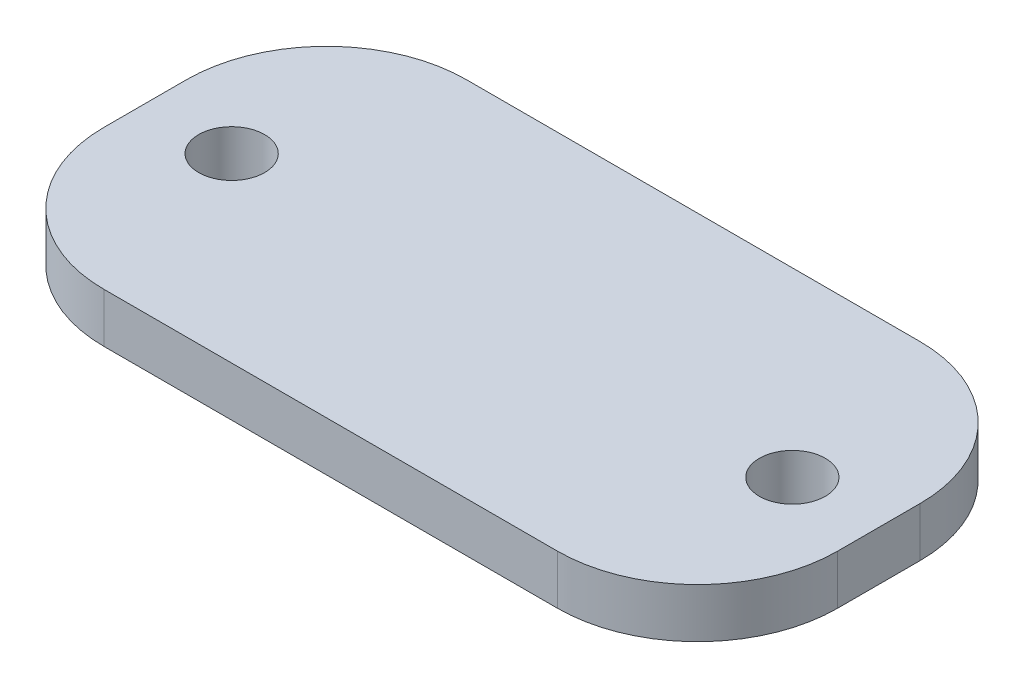
ISO-10303-21;
HEADER;
FILE_DESCRIPTION(('STEP AP214'),'2;1');
FILE_NAME('part.step','',(''),(''),'','','');
FILE_SCHEMA(('AUTOMOTIVE_DESIGN { 1 0 10303 214 1 1 1 1 }'));
ENDSEC;
DATA;
#1=APPLICATION_CONTEXT('core data for automotive mechanical design processes');
#2=APPLICATION_PROTOCOL_DEFINITION('international standard','automotive_design',2000,#1);
#3=PRODUCT_CONTEXT('',#1,'mechanical');
#4=PRODUCT('Part','Part','',(#3));
#5=PRODUCT_RELATED_PRODUCT_CATEGORY('part','',(#4));
#6=PRODUCT_DEFINITION_FORMATION('','',#4);
#7=PRODUCT_DEFINITION_CONTEXT('part definition',#1,'design');
#8=PRODUCT_DEFINITION('design','',#6,#7);
#9=PRODUCT_DEFINITION_SHAPE('','',#8);
#10=(LENGTH_UNIT() NAMED_UNIT(*) SI_UNIT(.MILLI.,.METRE.));
#11=(NAMED_UNIT(*) PLANE_ANGLE_UNIT() SI_UNIT($,.RADIAN.));
#12=(NAMED_UNIT(*) SI_UNIT($,.STERADIAN.) SOLID_ANGLE_UNIT());
#13=UNCERTAINTY_MEASURE_WITH_UNIT(LENGTH_MEASURE(1.E-05),#10,'distance_accuracy_value','');
#14=(GEOMETRIC_REPRESENTATION_CONTEXT(3) GLOBAL_UNCERTAINTY_ASSIGNED_CONTEXT((#13)) GLOBAL_UNIT_ASSIGNED_CONTEXT((#10,
#11,#12)) REPRESENTATION_CONTEXT('',''));
#15=CARTESIAN_POINT('',(0.,0.,0.));
#16=DIRECTION('',(0.,0.,1.));
#17=DIRECTION('',(1.,0.,0.));
#18=AXIS2_PLACEMENT_3D('',#15,#16,#17);
#19=CARTESIAN_POINT('',(22.25,3.,-11.));
#20=DIRECTION('',(-1.,0.,0.));
#21=DIRECTION('',(0.,0.,1.));
#22=AXIS2_PLACEMENT_3D('',#19,#20,#21);
#23=PLANE('',#22);
#24=DIRECTION('',(0.,0.,-1.));
#25=VECTOR('',#24,1.);
#26=CARTESIAN_POINT('',(22.25,0.,-11.));
#27=LINE('',#26,#25);
#28=CARTESIAN_POINT('',(22.25,0.,2.5));
#29=VERTEX_POINT('',#28);
#30=CARTESIAN_POINT('',(22.25,0.,-2.5));
#31=VERTEX_POINT('',#30);
#32=EDGE_CURVE('E142',#29,#31,#27,.T.);
#33=ORIENTED_EDGE('',*,*,#32,.T.);
#34=DIRECTION('',(0.,-1.,0.));
#35=VECTOR('',#34,1.);
#36=CARTESIAN_POINT('',(22.25,3.,-2.5));
#37=LINE('',#36,#35);
#38=CARTESIAN_POINT('',(22.25,3.,-2.5));
#39=VERTEX_POINT('',#38);
#40=EDGE_CURVE('E117',#31,#39,#37,.F.);
#41=ORIENTED_EDGE('',*,*,#40,.T.);
#42=DIRECTION('',(0.,0.,-1.));
#43=VECTOR('',#42,1.);
#44=CARTESIAN_POINT('',(22.25,3.,-11.));
#45=LINE('',#44,#43);
#46=CARTESIAN_POINT('',(22.25,3.,2.5));
#47=VERTEX_POINT('',#46);
#48=EDGE_CURVE('E155',#47,#39,#45,.T.);
#49=ORIENTED_EDGE('',*,*,#48,.F.);
#50=DIRECTION('',(0.,-1.,0.));
#51=VECTOR('',#50,1.);
#52=CARTESIAN_POINT('',(22.25,3.,2.5));
#53=LINE('',#52,#51);
#54=EDGE_CURVE('E123',#47,#29,#53,.T.);
#55=ORIENTED_EDGE('',*,*,#54,.T.);
#56=EDGE_LOOP('',(#33,#41,#49,#55));
#57=FACE_BOUND('',#56,.T.);
#58=ADVANCED_FACE('F45',(#57),#23,.F.);
#59=CARTESIAN_POINT('',(-22.25,3.,-11.));
#60=DIRECTION('',(0.,0.,1.));
#61=DIRECTION('',(1.,0.,0.));
#62=AXIS2_PLACEMENT_3D('',#59,#60,#61);
#63=PLANE('',#62);
#64=DIRECTION('',(-1.,0.,0.));
#65=VECTOR('',#64,1.);
#66=CARTESIAN_POINT('',(-22.25,3.,-11.));
#67=LINE('',#66,#65);
#68=CARTESIAN_POINT('',(13.75,3.,-11.));
#69=VERTEX_POINT('',#68);
#70=CARTESIAN_POINT('',(-13.75,3.,-11.));
#71=VERTEX_POINT('',#70);
#72=EDGE_CURVE('E133',#69,#71,#67,.T.);
#73=ORIENTED_EDGE('',*,*,#72,.F.);
#74=DIRECTION('',(0.,-1.,0.));
#75=VECTOR('',#74,1.);
#76=CARTESIAN_POINT('',(13.75,3.,-11.));
#77=LINE('',#76,#75);
#78=CARTESIAN_POINT('',(13.75,0.,-11.));
#79=VERTEX_POINT('',#78);
#80=EDGE_CURVE('E116',#69,#79,#77,.T.);
#81=ORIENTED_EDGE('',*,*,#80,.T.);
#82=DIRECTION('',(-1.,0.,0.));
#83=VECTOR('',#82,1.);
#84=CARTESIAN_POINT('',(-22.25,0.,-11.));
#85=LINE('',#84,#83);
#86=CARTESIAN_POINT('',(-13.75,0.,-11.));
#87=VERTEX_POINT('',#86);
#88=EDGE_CURVE('E130',#79,#87,#85,.T.);
#89=ORIENTED_EDGE('',*,*,#88,.T.);
#90=DIRECTION('',(0.,-1.,0.));
#91=VECTOR('',#90,1.);
#92=CARTESIAN_POINT('',(-13.75,3.,-11.));
#93=LINE('',#92,#91);
#94=EDGE_CURVE('E136',#87,#71,#93,.F.);
#95=ORIENTED_EDGE('',*,*,#94,.T.);
#96=EDGE_LOOP('',(#73,#81,#89,#95));
#97=FACE_BOUND('',#96,.T.);
#98=ADVANCED_FACE('F129',(#97),#63,.F.);
#99=CARTESIAN_POINT('',(-22.25,3.,-11.));
#100=DIRECTION('',(1.,0.,0.));
#101=DIRECTION('',(0.,0.,-1.));
#102=AXIS2_PLACEMENT_3D('',#99,#100,#101);
#103=PLANE('',#102);
#104=DIRECTION('',(0.,0.,1.));
#105=VECTOR('',#104,1.);
#106=CARTESIAN_POINT('',(-22.25,0.,-11.));
#107=LINE('',#106,#105);
#108=CARTESIAN_POINT('',(-22.25,0.,-2.5));
#109=VERTEX_POINT('',#108);
#110=CARTESIAN_POINT('',(-22.25,0.,2.5));
#111=VERTEX_POINT('',#110);
#112=EDGE_CURVE('E141',#109,#111,#107,.T.);
#113=ORIENTED_EDGE('',*,*,#112,.T.);
#114=DIRECTION('',(0.,-1.,0.));
#115=VECTOR('',#114,1.);
#116=CARTESIAN_POINT('',(-22.25,3.,2.5));
#117=LINE('',#116,#115);
#118=CARTESIAN_POINT('',(-22.25,3.,2.5));
#119=VERTEX_POINT('',#118);
#120=EDGE_CURVE('E11',#111,#119,#117,.F.);
#121=ORIENTED_EDGE('',*,*,#120,.T.);
#122=DIRECTION('',(0.,0.,1.));
#123=VECTOR('',#122,1.);
#124=CARTESIAN_POINT('',(-22.25,3.,-11.));
#125=LINE('',#124,#123);
#126=CARTESIAN_POINT('',(-22.25,3.,-2.5));
#127=VERTEX_POINT('',#126);
#128=EDGE_CURVE('E194',#127,#119,#125,.T.);
#129=ORIENTED_EDGE('',*,*,#128,.F.);
#130=DIRECTION('',(0.,-1.,0.));
#131=VECTOR('',#130,1.);
#132=CARTESIAN_POINT('',(-22.25,3.,-2.5));
#133=LINE('',#132,#131);
#134=EDGE_CURVE('E54',#127,#109,#133,.T.);
#135=ORIENTED_EDGE('',*,*,#134,.T.);
#136=EDGE_LOOP('',(#113,#121,#129,#135));
#137=FACE_BOUND('',#136,.T.);
#138=ADVANCED_FACE('F192',(#137),#103,.F.);
#139=CARTESIAN_POINT('',(-22.25,3.,11.));
#140=DIRECTION('',(0.,0.,-1.));
#141=DIRECTION('',(-1.,0.,0.));
#142=AXIS2_PLACEMENT_3D('',#139,#140,#141);
#143=PLANE('',#142);
#144=DIRECTION('',(1.,0.,0.));
#145=VECTOR('',#144,1.);
#146=CARTESIAN_POINT('',(-22.25,0.,11.));
#147=LINE('',#146,#145);
#148=CARTESIAN_POINT('',(-13.75,0.,11.));
#149=VERTEX_POINT('',#148);
#150=CARTESIAN_POINT('',(13.75,0.,11.));
#151=VERTEX_POINT('',#150);
#152=EDGE_CURVE('E147',#149,#151,#147,.T.);
#153=ORIENTED_EDGE('',*,*,#152,.T.);
#154=DIRECTION('',(0.,-1.,0.));
#155=VECTOR('',#154,1.);
#156=CARTESIAN_POINT('',(13.75,3.,11.));
#157=LINE('',#156,#155);
#158=CARTESIAN_POINT('',(13.75,3.,11.));
#159=VERTEX_POINT('',#158);
#160=EDGE_CURVE('E61',#151,#159,#157,.F.);
#161=ORIENTED_EDGE('',*,*,#160,.T.);
#162=DIRECTION('',(1.,0.,0.));
#163=VECTOR('',#162,1.);
#164=CARTESIAN_POINT('',(-22.25,3.,11.));
#165=LINE('',#164,#163);
#166=CARTESIAN_POINT('',(-13.75,3.,11.));
#167=VERTEX_POINT('',#166);
#168=EDGE_CURVE('E157',#167,#159,#165,.T.);
#169=ORIENTED_EDGE('',*,*,#168,.F.);
#170=DIRECTION('',(0.,-1.,0.));
#171=VECTOR('',#170,1.);
#172=CARTESIAN_POINT('',(-13.75,3.,11.));
#173=LINE('',#172,#171);
#174=EDGE_CURVE('E182',#167,#149,#173,.T.);
#175=ORIENTED_EDGE('',*,*,#174,.T.);
#176=EDGE_LOOP('',(#153,#161,#169,#175));
#177=FACE_BOUND('',#176,.T.);
#178=ADVANCED_FACE('F201',(#177),#143,.F.);
#179=CARTESIAN_POINT('',(0.,3.,0.));
#180=DIRECTION('',(0.,1.,0.));
#181=DIRECTION('',(0.,0.,1.));
#182=AXIS2_PLACEMENT_3D('',#179,#180,#181);
#183=PLANE('',#182);
#184=CARTESIAN_POINT('',(-17.,3.,0.));
#185=DIRECTION('',(0.,1.,0.));
#186=DIRECTION('',(0.,0.,1.));
#187=AXIS2_PLACEMENT_3D('',#184,#185,#186);
#188=CIRCLE('',#187,2.);
#189=CARTESIAN_POINT('',(-17.,3.,2.));
#190=VERTEX_POINT('',#189);
#191=EDGE_CURVE('E220',#190,#190,#188,.T.);
#192=ORIENTED_EDGE('',*,*,#191,.F.);
#193=EDGE_LOOP('',(#192));
#194=FACE_BOUND('',#193,.T.);
#195=CARTESIAN_POINT('',(17.,3.,0.));
#196=DIRECTION('',(0.,1.,0.));
#197=DIRECTION('',(0.,0.,1.));
#198=AXIS2_PLACEMENT_3D('',#195,#196,#197);
#199=CIRCLE('',#198,2.);
#200=CARTESIAN_POINT('',(17.,3.,2.));
#201=VERTEX_POINT('',#200);
#202=EDGE_CURVE('E216',#201,#201,#199,.T.);
#203=ORIENTED_EDGE('',*,*,#202,.F.);
#204=EDGE_LOOP('',(#203));
#205=FACE_BOUND('',#204,.T.);
#206=ORIENTED_EDGE('',*,*,#48,.T.);
#207=CARTESIAN_POINT('',(13.75,3.,-2.5));
#208=DIRECTION('',(0.,1.,0.));
#209=DIRECTION('',(0.,0.,1.));
#210=AXIS2_PLACEMENT_3D('',#207,#208,#209);
#211=CIRCLE('',#210,8.5);
#212=EDGE_CURVE('E179',#39,#69,#211,.T.);
#213=ORIENTED_EDGE('',*,*,#212,.T.);
#214=ORIENTED_EDGE('',*,*,#72,.T.);
#215=CARTESIAN_POINT('',(-13.75,3.,-2.5));
#216=DIRECTION('',(0.,1.,0.));
#217=DIRECTION('',(0.,0.,1.));
#218=AXIS2_PLACEMENT_3D('',#215,#216,#217);
#219=CIRCLE('',#218,8.5);
#220=EDGE_CURVE('E171',#71,#127,#219,.T.);
#221=ORIENTED_EDGE('',*,*,#220,.T.);
#222=ORIENTED_EDGE('',*,*,#128,.T.);
#223=CARTESIAN_POINT('',(-13.75,3.,2.5));
#224=DIRECTION('',(0.,1.,0.));
#225=DIRECTION('',(0.,0.,1.));
#226=AXIS2_PLACEMENT_3D('',#223,#224,#225);
#227=CIRCLE('',#226,8.5);
#228=EDGE_CURVE('E68',#119,#167,#227,.T.);
#229=ORIENTED_EDGE('',*,*,#228,.T.);
#230=ORIENTED_EDGE('',*,*,#168,.T.);
#231=CARTESIAN_POINT('',(13.75,3.,2.5));
#232=DIRECTION('',(0.,1.,0.));
#233=DIRECTION('',(0.,0.,1.));
#234=AXIS2_PLACEMENT_3D('',#231,#232,#233);
#235=CIRCLE('',#234,8.5);
#236=EDGE_CURVE('E176',#159,#47,#235,.T.);
#237=ORIENTED_EDGE('',*,*,#236,.T.);
#238=EDGE_LOOP('',(#206,#213,#214,#221,#222,#229,#230,#237));
#239=FACE_BOUND('',#238,.T.);
#240=ADVANCED_FACE('F237',(#194,#205,#239),#183,.T.);
#241=CARTESIAN_POINT('',(0.,0.,0.));
#242=DIRECTION('',(0.,1.,0.));
#243=DIRECTION('',(0.,0.,1.));
#244=AXIS2_PLACEMENT_3D('',#241,#242,#243);
#245=PLANE('',#244);
#246=CARTESIAN_POINT('',(-17.,0.,0.));
#247=DIRECTION('',(0.,1.,0.));
#248=DIRECTION('',(0.,0.,1.));
#249=AXIS2_PLACEMENT_3D('',#246,#247,#248);
#250=CIRCLE('',#249,2.);
#251=CARTESIAN_POINT('',(-17.,0.,2.));
#252=VERTEX_POINT('',#251);
#253=EDGE_CURVE('E149',#252,#252,#250,.T.);
#254=ORIENTED_EDGE('',*,*,#253,.T.);
#255=EDGE_LOOP('',(#254));
#256=FACE_BOUND('',#255,.T.);
#257=CARTESIAN_POINT('',(17.,0.,0.));
#258=DIRECTION('',(0.,1.,0.));
#259=DIRECTION('',(0.,0.,1.));
#260=AXIS2_PLACEMENT_3D('',#257,#258,#259);
#261=CIRCLE('',#260,2.);
#262=CARTESIAN_POINT('',(17.,0.,2.));
#263=VERTEX_POINT('',#262);
#264=EDGE_CURVE('E212',#263,#263,#261,.T.);
#265=ORIENTED_EDGE('',*,*,#264,.T.);
#266=EDGE_LOOP('',(#265));
#267=FACE_BOUND('',#266,.T.);
#268=ORIENTED_EDGE('',*,*,#88,.F.);
#269=CARTESIAN_POINT('',(13.75,0.,-2.5));
#270=DIRECTION('',(0.,1.,0.));
#271=DIRECTION('',(0.,0.,1.));
#272=AXIS2_PLACEMENT_3D('',#269,#270,#271);
#273=CIRCLE('',#272,8.5);
#274=EDGE_CURVE('E112',#79,#31,#273,.F.);
#275=ORIENTED_EDGE('',*,*,#274,.T.);
#276=ORIENTED_EDGE('',*,*,#32,.F.);
#277=CARTESIAN_POINT('',(13.75,0.,2.5));
#278=DIRECTION('',(0.,1.,0.));
#279=DIRECTION('',(0.,0.,1.));
#280=AXIS2_PLACEMENT_3D('',#277,#278,#279);
#281=CIRCLE('',#280,8.5);
#282=EDGE_CURVE('E124',#29,#151,#281,.F.);
#283=ORIENTED_EDGE('',*,*,#282,.T.);
#284=ORIENTED_EDGE('',*,*,#152,.F.);
#285=CARTESIAN_POINT('',(-13.75,0.,2.5));
#286=DIRECTION('',(0.,1.,0.));
#287=DIRECTION('',(0.,0.,1.));
#288=AXIS2_PLACEMENT_3D('',#285,#286,#287);
#289=CIRCLE('',#288,8.5);
#290=EDGE_CURVE('E161',#149,#111,#289,.F.);
#291=ORIENTED_EDGE('',*,*,#290,.T.);
#292=ORIENTED_EDGE('',*,*,#112,.F.);
#293=CARTESIAN_POINT('',(-13.75,0.,-2.5));
#294=DIRECTION('',(0.,1.,0.));
#295=DIRECTION('',(0.,0.,1.));
#296=AXIS2_PLACEMENT_3D('',#293,#294,#295);
#297=CIRCLE('',#296,8.5);
#298=EDGE_CURVE('E135',#109,#87,#297,.F.);
#299=ORIENTED_EDGE('',*,*,#298,.T.);
#300=EDGE_LOOP('',(#268,#275,#276,#283,#284,#291,#292,#299));
#301=FACE_BOUND('',#300,.T.);
#302=ADVANCED_FACE('F138',(#256,#267,#301),#245,.F.);
#303=CARTESIAN_POINT('',(13.75,3.,-2.5));
#304=DIRECTION('',(0.,-1.,0.));
#305=DIRECTION('',(0.,0.,-1.));
#306=AXIS2_PLACEMENT_3D('',#303,#304,#305);
#307=CYLINDRICAL_SURFACE('',#306,8.5);
#308=ORIENTED_EDGE('',*,*,#212,.F.);
#309=ORIENTED_EDGE('',*,*,#40,.F.);
#310=ORIENTED_EDGE('',*,*,#274,.F.);
#311=ORIENTED_EDGE('',*,*,#80,.F.);
#312=EDGE_LOOP('',(#308,#309,#310,#311));
#313=FACE_BOUND('',#312,.T.);
#314=ADVANCED_FACE('F115',(#313),#307,.T.);
#315=CARTESIAN_POINT('',(13.75,3.,2.5));
#316=DIRECTION('',(0.,-1.,0.));
#317=DIRECTION('',(0.,0.,-1.));
#318=AXIS2_PLACEMENT_3D('',#315,#316,#317);
#319=CYLINDRICAL_SURFACE('',#318,8.5);
#320=ORIENTED_EDGE('',*,*,#236,.F.);
#321=ORIENTED_EDGE('',*,*,#160,.F.);
#322=ORIENTED_EDGE('',*,*,#282,.F.);
#323=ORIENTED_EDGE('',*,*,#54,.F.);
#324=EDGE_LOOP('',(#320,#321,#322,#323));
#325=FACE_BOUND('',#324,.T.);
#326=ADVANCED_FACE('F246',(#325),#319,.T.);
#327=CARTESIAN_POINT('',(-13.75,3.,2.5));
#328=DIRECTION('',(0.,-1.,0.));
#329=DIRECTION('',(0.,0.,-1.));
#330=AXIS2_PLACEMENT_3D('',#327,#328,#329);
#331=CYLINDRICAL_SURFACE('',#330,8.5);
#332=ORIENTED_EDGE('',*,*,#228,.F.);
#333=ORIENTED_EDGE('',*,*,#120,.F.);
#334=ORIENTED_EDGE('',*,*,#290,.F.);
#335=ORIENTED_EDGE('',*,*,#174,.F.);
#336=EDGE_LOOP('',(#332,#333,#334,#335));
#337=FACE_BOUND('',#336,.T.);
#338=ADVANCED_FACE('F200',(#337),#331,.T.);
#339=CARTESIAN_POINT('',(-13.75,3.,-2.5));
#340=DIRECTION('',(0.,-1.,0.));
#341=DIRECTION('',(0.,0.,-1.));
#342=AXIS2_PLACEMENT_3D('',#339,#340,#341);
#343=CYLINDRICAL_SURFACE('',#342,8.5);
#344=ORIENTED_EDGE('',*,*,#220,.F.);
#345=ORIENTED_EDGE('',*,*,#94,.F.);
#346=ORIENTED_EDGE('',*,*,#298,.F.);
#347=ORIENTED_EDGE('',*,*,#134,.F.);
#348=EDGE_LOOP('',(#344,#345,#346,#347));
#349=FACE_BOUND('',#348,.T.);
#350=ADVANCED_FACE('F47',(#349),#343,.T.);
#351=CARTESIAN_POINT('',(17.,0.,0.));
#352=DIRECTION('',(0.,1.,0.));
#353=DIRECTION('',(0.,0.,1.));
#354=AXIS2_PLACEMENT_3D('',#351,#352,#353);
#355=CYLINDRICAL_SURFACE('',#354,2.);
#356=ORIENTED_EDGE('',*,*,#264,.F.);
#357=EDGE_LOOP('',(#356));
#358=FACE_BOUND('',#357,.T.);
#359=ORIENTED_EDGE('',*,*,#202,.T.);
#360=EDGE_LOOP('',(#359));
#361=FACE_BOUND('',#360,.T.);
#362=ADVANCED_FACE('F233',(#358,#361),#355,.F.);
#363=CARTESIAN_POINT('',(-17.,0.,0.));
#364=DIRECTION('',(0.,1.,0.));
#365=DIRECTION('',(0.,0.,1.));
#366=AXIS2_PLACEMENT_3D('',#363,#364,#365);
#367=CYLINDRICAL_SURFACE('',#366,2.);
#368=ORIENTED_EDGE('',*,*,#253,.F.);
#369=EDGE_LOOP('',(#368));
#370=FACE_BOUND('',#369,.T.);
#371=ORIENTED_EDGE('',*,*,#191,.T.);
#372=EDGE_LOOP('',(#371));
#373=FACE_BOUND('',#372,.T.);
#374=ADVANCED_FACE('F230',(#370,#373),#367,.F.);
#375=CLOSED_SHELL('',(#58,#98,#138,#178,#240,#302,#314,#326,#338,#350,#362,#374));
#376=MANIFOLD_SOLID_BREP('B2',#375);
#377=ADVANCED_BREP_SHAPE_REPRESENTATION('',(#18,#376),#14);
#378=SHAPE_DEFINITION_REPRESENTATION(#9,#377);
ENDSEC;
END-ISO-10303-21;
